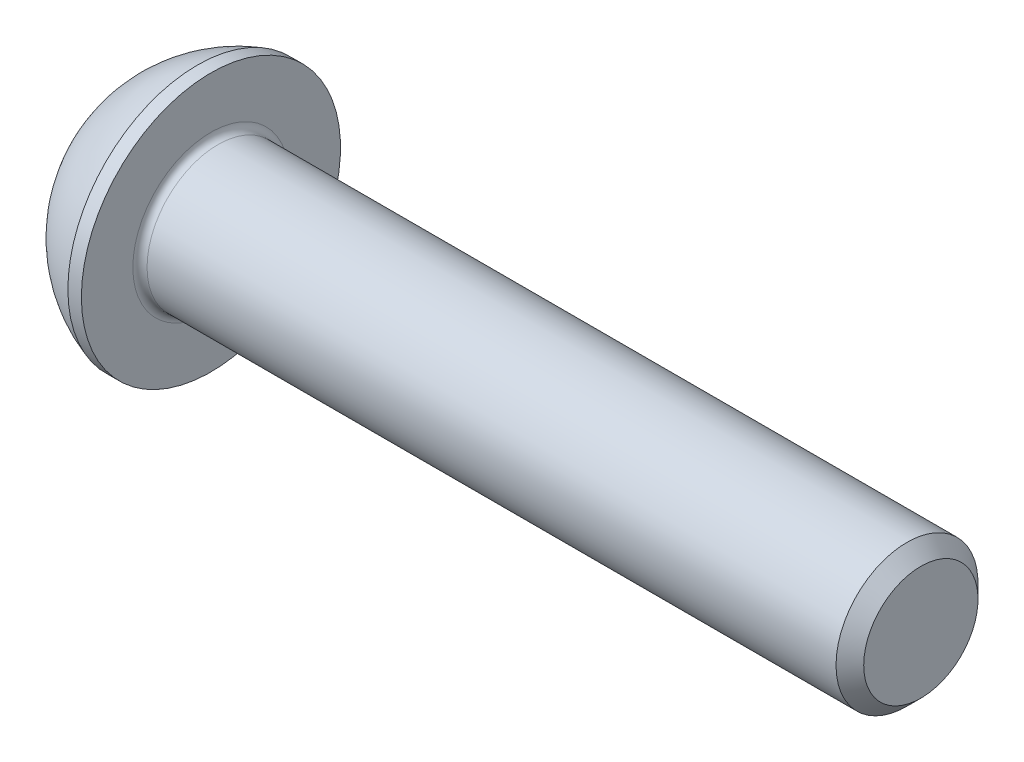
ISO-10303-21;
HEADER;
FILE_DESCRIPTION(('STEP AP214'),'2;1');
FILE_NAME('part.step','',(''),(''),'','','');
FILE_SCHEMA(('AUTOMOTIVE_DESIGN { 1 0 10303 214 1 1 1 1 }'));
ENDSEC;
DATA;
#1=APPLICATION_CONTEXT('core data for automotive mechanical design processes');
#2=APPLICATION_PROTOCOL_DEFINITION('international standard','automotive_design',2000,#1);
#3=PRODUCT_CONTEXT('',#1,'mechanical');
#4=PRODUCT('Part','Part','',(#3));
#5=PRODUCT_RELATED_PRODUCT_CATEGORY('part','',(#4));
#6=PRODUCT_DEFINITION_FORMATION('','',#4);
#7=PRODUCT_DEFINITION_CONTEXT('part definition',#1,'design');
#8=PRODUCT_DEFINITION('design','',#6,#7);
#9=PRODUCT_DEFINITION_SHAPE('','',#8);
#10=(LENGTH_UNIT() NAMED_UNIT(*) SI_UNIT(.MILLI.,.METRE.));
#11=(NAMED_UNIT(*) PLANE_ANGLE_UNIT() SI_UNIT($,.RADIAN.));
#12=(NAMED_UNIT(*) SI_UNIT($,.STERADIAN.) SOLID_ANGLE_UNIT());
#13=UNCERTAINTY_MEASURE_WITH_UNIT(LENGTH_MEASURE(1.E-05),#10,'distance_accuracy_value','');
#14=(GEOMETRIC_REPRESENTATION_CONTEXT(3) GLOBAL_UNCERTAINTY_ASSIGNED_CONTEXT((#13)) GLOBAL_UNIT_ASSIGNED_CONTEXT((#10,
#11,#12)) REPRESENTATION_CONTEXT('',''));
#15=CARTESIAN_POINT('',(0.,0.,0.));
#16=DIRECTION('',(0.,0.,1.));
#17=DIRECTION('',(1.,0.,0.));
#18=AXIS2_PLACEMENT_3D('',#15,#16,#17);
#19=CARTESIAN_POINT('',(0.,0.,0.));
#20=DIRECTION('',(-1.,0.,0.));
#21=DIRECTION('',(0.,0.,1.));
#22=AXIS2_PLACEMENT_3D('',#19,#20,#21);
#23=PLANE('',#22);
#24=CARTESIAN_POINT('',(0.,0.,0.));
#25=DIRECTION('',(-1.,0.,0.));
#26=DIRECTION('',(0.,0.,1.));
#27=AXIS2_PLACEMENT_3D('',#24,#25,#26);
#28=CIRCLE('',#27,1.825);
#29=CARTESIAN_POINT('',(0.,1.825,0.));
#30=VERTEX_POINT('',#29);
#31=EDGE_CURVE('E156',#30,#30,#28,.T.);
#32=ORIENTED_EDGE('',*,*,#31,.T.);
#33=EDGE_LOOP('',(#32));
#34=FACE_BOUND('',#33,.T.);
#35=DIRECTION('',(0.,-1.,0.));
#36=VECTOR('',#35,1.);
#37=CARTESIAN_POINT('',(0.,-0.721687836487031,1.25));
#38=LINE('',#37,#36);
#39=CARTESIAN_POINT('',(0.,0.721687836487033,1.25));
#40=VERTEX_POINT('',#39);
#41=CARTESIAN_POINT('',(0.,-0.721687836487031,1.25));
#42=VERTEX_POINT('',#41);
#43=EDGE_CURVE('E51',#40,#42,#38,.T.);
#44=ORIENTED_EDGE('',*,*,#43,.T.);
#45=DIRECTION('',(0.,-0.5,-0.866025403784438));
#46=VECTOR('',#45,1.);
#47=CARTESIAN_POINT('',(0.,-1.44337567297406,0.));
#48=LINE('',#47,#46);
#49=CARTESIAN_POINT('',(0.,-1.44337567297406,0.));
#50=VERTEX_POINT('',#49);
#51=EDGE_CURVE('E276',#42,#50,#48,.T.);
#52=ORIENTED_EDGE('',*,*,#51,.T.);
#53=DIRECTION('',(0.,0.5,-0.866025403784438));
#54=VECTOR('',#53,1.);
#55=CARTESIAN_POINT('',(0.,-0.721687836487032,-1.25));
#56=LINE('',#55,#54);
#57=CARTESIAN_POINT('',(0.,-0.721687836487032,-1.25));
#58=VERTEX_POINT('',#57);
#59=EDGE_CURVE('E131',#50,#58,#56,.T.);
#60=ORIENTED_EDGE('',*,*,#59,.T.);
#61=DIRECTION('',(0.,1.,0.));
#62=VECTOR('',#61,1.);
#63=CARTESIAN_POINT('',(0.,0.721687836487033,-1.25));
#64=LINE('',#63,#62);
#65=CARTESIAN_POINT('',(0.,0.721687836487033,-1.25));
#66=VERTEX_POINT('',#65);
#67=EDGE_CURVE('E279',#58,#66,#64,.T.);
#68=ORIENTED_EDGE('',*,*,#67,.T.);
#69=DIRECTION('',(0.,0.5,0.866025403784439));
#70=VECTOR('',#69,1.);
#71=CARTESIAN_POINT('',(0.,1.44337567297406,0.));
#72=LINE('',#71,#70);
#73=CARTESIAN_POINT('',(0.,1.44337567297406,0.));
#74=VERTEX_POINT('',#73);
#75=EDGE_CURVE('E281',#66,#74,#72,.T.);
#76=ORIENTED_EDGE('',*,*,#75,.T.);
#77=DIRECTION('',(0.,-0.5,0.866025403784439));
#78=VECTOR('',#77,1.);
#79=CARTESIAN_POINT('',(0.,0.721687836487033,1.25));
#80=LINE('',#79,#78);
#81=EDGE_CURVE('E283',#74,#40,#80,.T.);
#82=ORIENTED_EDGE('',*,*,#81,.T.);
#83=EDGE_LOOP('',(#44,#52,#60,#68,#76,#82));
#84=FACE_BOUND('',#83,.T.);
#85=ADVANCED_FACE('F36',(#34,#84),#23,.T.);
#86=CARTESIAN_POINT('',(3.3604222972973,0.,0.));
#87=DIRECTION('',(-1.,0.,0.));
#88=DIRECTION('',(0.,1.,0.));
#89=AXIS2_PLACEMENT_3D('',#86,#87,#88);
#90=SPHERICAL_SURFACE('',#89,3.82401137762074);
#91=CARTESIAN_POINT('',(2.22,0.,0.));
#92=DIRECTION('',(-1.,0.,0.));
#93=DIRECTION('',(0.,0.,1.));
#94=AXIS2_PLACEMENT_3D('',#91,#92,#93);
#95=CIRCLE('',#94,3.65);
#96=CARTESIAN_POINT('',(2.22,3.65,0.));
#97=VERTEX_POINT('',#96);
#98=EDGE_CURVE('E153',#97,#97,#95,.T.);
#99=CARTESIAN_POINT('',(2.22,3.65,0.));
#100=CARTESIAN_POINT('',(2.19070712092739,3.64084768261925,0.));
#101=CARTESIAN_POINT('',(2.16152446788423,3.63134259000291,0.));
#102=CARTESIAN_POINT('',(2.10339642085991,3.61163268371805,0.));
#103=CARTESIAN_POINT('',(2.07445102687874,3.60142787004953,0.));
#104=CARTESIAN_POINT('',(2.01681430498153,3.58032435107931,0.));
#105=CARTESIAN_POINT('',(1.98812297706548,3.56942564577762,0.));
#106=CARTESIAN_POINT('',(1.93101101018473,3.54694068384492,0.));
#107=CARTESIAN_POINT('',(1.90259037122003,3.53535442721391,0.));
#108=CARTESIAN_POINT('',(1.84603625809961,3.51150107233964,0.));
#109=CARTESIAN_POINT('',(1.8179027839439,3.49923397409637,0.));
#110=CARTESIAN_POINT('',(1.76193930720089,3.47402604816104,0.));
#111=CARTESIAN_POINT('',(1.73410930461359,3.46108522046899,0.));
#112=CARTESIAN_POINT('',(1.67876890257114,3.43453733623015,0.));
#113=CARTESIAN_POINT('',(1.65125850311598,3.42093027968337,0.));
#114=CARTESIAN_POINT('',(1.59657325345647,3.39305782506298,0.));
#115=CARTESIAN_POINT('',(1.56939840325212,3.37879242698938,0.));
#116=CARTESIAN_POINT('',(1.51540000376563,3.34961155809499,0.));
#117=CARTESIAN_POINT('',(1.48857645448349,3.33469608727419,0.));
#118=CARTESIAN_POINT('',(1.43529620487076,3.30422371851414,0.));
#119=CARTESIAN_POINT('',(1.40883950454015,3.28866682057488,0.));
#120=CARTESIAN_POINT('',(1.35630828822271,3.25692061499341,0.));
#121=CARTESIAN_POINT('',(1.33023377223587,3.2407313073512,0.));
#122=CARTESIAN_POINT('',(1.27848203846745,3.20772966635286,0.));
#123=CARTESIAN_POINT('',(1.25280482068587,3.19091733299673,0.));
#124=CARTESIAN_POINT('',(1.20186256689933,3.15667938569018,0.));
#125=CARTESIAN_POINT('',(1.17659753089438,3.13925377173975,0.));
#126=CARTESIAN_POINT('',(1.12649428531491,3.10379936384706,0.));
#127=CARTESIAN_POINT('',(1.10165607574039,3.08577056990479,0.));
#128=CARTESIAN_POINT('',(1.05242088026944,3.04912025225874,0.));
#129=CARTESIAN_POINT('',(1.02802389437301,3.03049872855496,0.));
#130=CARTESIAN_POINT('',(0.979685287754531,2.9926737451868,0.));
#131=CARTESIAN_POINT('',(0.955743667032474,2.97347028552241,0.));
#132=CARTESIAN_POINT('',(0.908329668310624,2.93449256134791,0.));
#133=CARTESIAN_POINT('',(0.88485729031083,2.91471829683781,0.));
#134=CARTESIAN_POINT('',(0.838395382589022,2.87461042494875,0.));
#135=CARTESIAN_POINT('',(0.815405852867006,2.8542768175698,0.));
#136=CARTESIAN_POINT('',(0.769922967377556,2.81306204613804,0.));
#137=CARTESIAN_POINT('',(0.747429611610121,2.79218088208524,0.));
#138=CARTESIAN_POINT('',(0.70295211210379,2.74988310088713,0.));
#139=CARTESIAN_POINT('',(0.680967968364895,2.72846648374183,0.));
#140=CARTESIAN_POINT('',(0.637521635829424,2.68511021031069,0.));
#141=CARTESIAN_POINT('',(0.616059447032848,2.66317055402486,0.));
#142=CARTESIAN_POINT('',(0.573669464749056,2.61878091943974,0.));
#143=CARTESIAN_POINT('',(0.552741671261841,2.59633094114045,0.));
#144=CARTESIAN_POINT('',(0.511432610207024,2.55093367545869,0.));
#145=CARTESIAN_POINT('',(0.491051342639423,2.52798638807622,0.));
#146=CARTESIAN_POINT('',(0.450847147242546,2.48160780542071,0.));
#147=CARTESIAN_POINT('',(0.431024219413271,2.45817651014767,0.));
#148=CARTESIAN_POINT('',(0.391948193684953,2.41084349344881,0.));
#149=CARTESIAN_POINT('',(0.37269509578591,2.386941772023,0.));
#150=CARTESIAN_POINT('',(0.334769889776281,2.33868175745591,0.));
#151=CARTESIAN_POINT('',(0.316097781665695,2.31432346431464,0.));
#152=CARTESIAN_POINT('',(0.279345378463054,2.26516442532271,0.));
#153=CARTESIAN_POINT('',(0.261265083370999,2.24036367947205,0.));
#154=CARTESIAN_POINT('',(0.225706785883461,2.19033411082596,0.));
#155=CARTESIAN_POINT('',(0.208228783487977,2.16510528803053,0.));
#156=CARTESIAN_POINT('',(0.173885203872077,2.11423418829049,0.));
#157=CARTESIAN_POINT('',(0.157019626651659,2.08859191134589,0.));
#158=CARTESIAN_POINT('',(0.123910667734166,2.03690876986336,0.));
#159=CARTESIAN_POINT('',(0.10766728603709,2.01086790532544,0.));
#160=CARTESIAN_POINT('',(0.0758121545239918,1.95840267092907,0.));
#161=CARTESIAN_POINT('',(0.0602004047079698,1.93197830107062,0.));
#162=CARTESIAN_POINT('',(0.029617507700087,1.87876141777946,0.));
#163=CARTESIAN_POINT('',(0.0146463605082264,1.85196890434674,0.));
#164=CARTESIAN_POINT('',(0.,1.825,0.));
#165=B_SPLINE_CURVE_WITH_KNOTS('',3,(#99,#100,#101,#102,#103,#104,#105,#106,#107,#108,#109,#110,
#111,#112,#113,#114,#115,#116,#117,#118,#119,#120,#121,#122,#123,#124,#125,#126,#127,#128,#129,
#130,#131,#132,#133,#134,#135,#136,#137,#138,#139,#140,#141,#142,#143,#144,#145,#146,#147,#148,
#149,#150,#151,#152,#153,#154,#155,#156,#157,#158,#159,#160,#161,#162,#163,#164),.UNSPECIFIED.,
.F.,.F.,(4,2,2,2,2,2,2,2,2,2,2,2,2,2,2,2,2,2,2,2,2,2,2,2,2,2,2,2,2,2,2,2,4),(0.,
0.0920658929861413,0.184131785972283,0.276197678958424,0.368263571944565,0.460329464930706,
0.552395357916847,0.644461250902988,0.736527143889129,0.828593036875271,0.920658929861412,
1.01272482284755,1.10479071583369,1.19685660881984,1.28892250180598,1.38098839479212,
1.47305428777826,1.5651201807644,1.65718607375054,1.74925196673668,1.84131785972282,
1.93338375270897,2.02544964569511,2.11751553868125,2.20958143166739,2.30164732465353,
2.39371321763967,2.48577911062581,2.57784500361196,2.6699108965981,2.76197678958424,
2.85404268257038,2.94610857555652),.UNSPECIFIED.);
#166=EDGE_CURVE('BSEAM177',#97,#30,#165,.T.);
#167=ORIENTED_EDGE('',*,*,#98,.T.);
#168=ORIENTED_EDGE('',*,*,#31,.F.);
#169=ORIENTED_EDGE('',*,*,#166,.T.);
#170=ORIENTED_EDGE('',*,*,#166,.F.);
#171=EDGE_LOOP('',(#167,#169,#168,#170));
#172=FACE_BOUND('',#171,.T.);
#173=ADVANCED_FACE('F177',(#172),#90,.T.);
#174=CARTESIAN_POINT('',(0.,0.,0.));
#175=DIRECTION('',(-1.,0.,0.));
#176=DIRECTION('',(0.,0.,1.));
#177=AXIS2_PLACEMENT_3D('',#174,#175,#176);
#178=CYLINDRICAL_SURFACE('',#177,3.65);
#179=ORIENTED_EDGE('',*,*,#98,.F.);
#180=EDGE_LOOP('',(#179));
#181=FACE_BOUND('',#180,.T.);
#182=CARTESIAN_POINT('',(2.6,0.,0.));
#183=DIRECTION('',(-1.,0.,0.));
#184=DIRECTION('',(0.,0.,1.));
#185=AXIS2_PLACEMENT_3D('',#182,#183,#184);
#186=CIRCLE('',#185,3.65);
#187=CARTESIAN_POINT('',(2.6,0.,3.65));
#188=VERTEX_POINT('',#187);
#189=EDGE_CURVE('E150',#188,#188,#186,.T.);
#190=ORIENTED_EDGE('',*,*,#189,.T.);
#191=EDGE_LOOP('',(#190));
#192=FACE_BOUND('',#191,.T.);
#193=ADVANCED_FACE('F182',(#181,#192),#178,.T.);
#194=CARTESIAN_POINT('',(2.6,2.,0.));
#195=DIRECTION('',(-1.,0.,0.));
#196=DIRECTION('',(0.,0.,1.));
#197=AXIS2_PLACEMENT_3D('',#194,#195,#196);
#198=PLANE('',#197);
#199=CARTESIAN_POINT('',(2.6,0.,0.));
#200=DIRECTION('',(-1.,0.,0.));
#201=DIRECTION('',(0.,0.,1.));
#202=AXIS2_PLACEMENT_3D('',#199,#200,#201);
#203=CIRCLE('',#202,2.2);
#204=CARTESIAN_POINT('',(2.6,0.,2.2));
#205=VERTEX_POINT('',#204);
#206=EDGE_CURVE('E44',#205,#205,#203,.T.);
#207=ORIENTED_EDGE('',*,*,#206,.T.);
#208=EDGE_LOOP('',(#207));
#209=FACE_BOUND('',#208,.T.);
#210=ORIENTED_EDGE('',*,*,#189,.F.);
#211=EDGE_LOOP('',(#210));
#212=FACE_BOUND('',#211,.T.);
#213=ADVANCED_FACE('F161',(#209,#212),#198,.F.);
#214=CARTESIAN_POINT('',(0.,0.,0.));
#215=DIRECTION('',(-1.,0.,0.));
#216=DIRECTION('',(0.,0.,1.));
#217=AXIS2_PLACEMENT_3D('',#214,#215,#216);
#218=CYLINDRICAL_SURFACE('',#217,2.);
#219=CARTESIAN_POINT('',(2.8,0.,0.));
#220=DIRECTION('',(-1.,0.,0.));
#221=DIRECTION('',(0.,0.,1.));
#222=AXIS2_PLACEMENT_3D('',#219,#220,#221);
#223=CIRCLE('',#222,2.);
#224=CARTESIAN_POINT('',(2.8,0.,2.));
#225=VERTEX_POINT('',#224);
#226=EDGE_CURVE('E11',#225,#225,#223,.F.);
#227=ORIENTED_EDGE('',*,*,#226,.T.);
#228=EDGE_LOOP('',(#227));
#229=FACE_BOUND('',#228,.T.);
#230=CARTESIAN_POINT('',(22.21,0.,0.));
#231=DIRECTION('',(-1.,0.,0.));
#232=DIRECTION('',(0.,0.,1.));
#233=AXIS2_PLACEMENT_3D('',#230,#231,#232);
#234=CIRCLE('',#233,2.);
#235=CARTESIAN_POINT('',(22.21,0.,2.));
#236=VERTEX_POINT('',#235);
#237=EDGE_CURVE('E147',#236,#236,#234,.T.);
#238=ORIENTED_EDGE('',*,*,#237,.T.);
#239=EDGE_LOOP('',(#238));
#240=FACE_BOUND('',#239,.T.);
#241=ADVANCED_FACE('F191',(#229,#240),#218,.T.);
#242=CARTESIAN_POINT('',(22.6,0.,0.));
#243=DIRECTION('',(-1.,0.,0.));
#244=DIRECTION('',(0.,0.,1.));
#245=AXIS2_PLACEMENT_3D('',#242,#243,#244);
#246=CONICAL_SURFACE('',#245,1.61,0.785398163397442);
#247=ORIENTED_EDGE('',*,*,#237,.F.);
#248=EDGE_LOOP('',(#247));
#249=FACE_BOUND('',#248,.T.);
#250=CARTESIAN_POINT('',(22.6,0.,0.));
#251=DIRECTION('',(-1.,0.,0.));
#252=DIRECTION('',(0.,0.,1.));
#253=AXIS2_PLACEMENT_3D('',#250,#251,#252);
#254=CIRCLE('',#253,1.61);
#255=CARTESIAN_POINT('',(22.6,0.,1.61));
#256=VERTEX_POINT('',#255);
#257=EDGE_CURVE('E143',#256,#256,#254,.T.);
#258=ORIENTED_EDGE('',*,*,#257,.T.);
#259=EDGE_LOOP('',(#258));
#260=FACE_BOUND('',#259,.T.);
#261=ADVANCED_FACE('F172',(#249,#260),#246,.T.);
#262=CARTESIAN_POINT('',(22.6,0.,0.));
#263=DIRECTION('',(-1.,0.,0.));
#264=DIRECTION('',(0.,0.,1.));
#265=AXIS2_PLACEMENT_3D('',#262,#263,#264);
#266=PLANE('',#265);
#267=ORIENTED_EDGE('',*,*,#257,.F.);
#268=EDGE_LOOP('',(#267));
#269=FACE_BOUND('',#268,.T.);
#270=ADVANCED_FACE('F165',(#269),#266,.F.);
#271=CARTESIAN_POINT('',(2.8,0.,0.));
#272=DIRECTION('',(-1.,0.,0.));
#273=DIRECTION('',(0.,0.,1.));
#274=AXIS2_PLACEMENT_3D('',#271,#272,#273);
#275=TOROIDAL_SURFACE('',#274,2.2,0.2);
#276=ORIENTED_EDGE('',*,*,#226,.F.);
#277=EDGE_LOOP('',(#276));
#278=FACE_BOUND('',#277,.T.);
#279=ORIENTED_EDGE('',*,*,#206,.F.);
#280=EDGE_LOOP('',(#279));
#281=FACE_BOUND('',#280,.T.);
#282=ADVANCED_FACE('F38',(#278,#281),#275,.F.);
#283=CARTESIAN_POINT('',(1.3,-1.44337567297406,0.));
#284=DIRECTION('',(0.,0.866025403784438,-0.5));
#285=DIRECTION('',(0.,0.5,0.866025403784438));
#286=AXIS2_PLACEMENT_3D('',#283,#284,#285);
#287=PLANE('',#286);
#288=DIRECTION('',(0.,-0.5,-0.866025403784438));
#289=VECTOR('',#288,1.);
#290=CARTESIAN_POINT('',(1.3,-1.44337567297406,0.));
#291=LINE('',#290,#289);
#292=CARTESIAN_POINT('',(1.3,-0.721687836487031,1.25));
#293=VERTEX_POINT('',#292);
#294=CARTESIAN_POINT('',(1.3,-1.08253175473055,0.625));
#295=VERTEX_POINT('',#294);
#296=EDGE_CURVE('E117',#293,#295,#291,.T.);
#297=ORIENTED_EDGE('',*,*,#296,.T.);
#298=CARTESIAN_POINT('',(1.3,-1.44337567297406,0.));
#299=VERTEX_POINT('',#298);
#300=EDGE_CURVE('E112',#295,#299,#291,.T.);
#301=ORIENTED_EDGE('',*,*,#300,.T.);
#302=DIRECTION('',(-1.,0.,0.));
#303=VECTOR('',#302,1.);
#304=CARTESIAN_POINT('',(1.3,-1.44337567297406,0.));
#305=LINE('',#304,#303);
#306=EDGE_CURVE('E114',#299,#50,#305,.T.);
#307=ORIENTED_EDGE('',*,*,#306,.T.);
#308=ORIENTED_EDGE('',*,*,#51,.F.);
#309=DIRECTION('',(-1.,0.,0.));
#310=VECTOR('',#309,1.);
#311=CARTESIAN_POINT('',(1.3,-0.721687836487031,1.25));
#312=LINE('',#311,#310);
#313=EDGE_CURVE('E272',#293,#42,#312,.T.);
#314=ORIENTED_EDGE('',*,*,#313,.F.);
#315=EDGE_LOOP('',(#297,#301,#307,#308,#314));
#316=FACE_BOUND('',#315,.T.);
#317=ADVANCED_FACE('F113',(#316),#287,.T.);
#318=CARTESIAN_POINT('',(1.3,-0.721687836487032,-1.25));
#319=DIRECTION('',(0.,0.866025403784438,0.5));
#320=DIRECTION('',(0.,-0.5,0.866025403784439));
#321=AXIS2_PLACEMENT_3D('',#318,#319,#320);
#322=PLANE('',#321);
#323=DIRECTION('',(0.,0.5,-0.866025403784438));
#324=VECTOR('',#323,1.);
#325=CARTESIAN_POINT('',(1.3,-0.721687836487032,-1.25));
#326=LINE('',#325,#324);
#327=CARTESIAN_POINT('',(1.3,-1.08253175473055,-0.625000000000001));
#328=VERTEX_POINT('',#327);
#329=EDGE_CURVE('E59',#299,#328,#326,.T.);
#330=ORIENTED_EDGE('',*,*,#329,.T.);
#331=CARTESIAN_POINT('',(1.3,-0.721687836487032,-1.25));
#332=VERTEX_POINT('',#331);
#333=EDGE_CURVE('E126',#328,#332,#326,.T.);
#334=ORIENTED_EDGE('',*,*,#333,.T.);
#335=DIRECTION('',(-1.,0.,0.));
#336=VECTOR('',#335,1.);
#337=CARTESIAN_POINT('',(1.3,-0.721687836487032,-1.25));
#338=LINE('',#337,#336);
#339=EDGE_CURVE('E133',#332,#58,#338,.T.);
#340=ORIENTED_EDGE('',*,*,#339,.T.);
#341=ORIENTED_EDGE('',*,*,#59,.F.);
#342=ORIENTED_EDGE('',*,*,#306,.F.);
#343=EDGE_LOOP('',(#330,#334,#340,#341,#342));
#344=FACE_BOUND('',#343,.T.);
#345=ADVANCED_FACE('F129',(#344),#322,.T.);
#346=CARTESIAN_POINT('',(1.3,0.721687836487033,-1.25));
#347=DIRECTION('',(0.,0.,1.));
#348=DIRECTION('',(1.,0.,0.));
#349=AXIS2_PLACEMENT_3D('',#346,#347,#348);
#350=PLANE('',#349);
#351=DIRECTION('',(0.,1.,0.));
#352=VECTOR('',#351,1.);
#353=CARTESIAN_POINT('',(1.3,0.721687836487033,-1.25));
#354=LINE('',#353,#352);
#355=CARTESIAN_POINT('',(1.3,0.,-1.25));
#356=VERTEX_POINT('',#355);
#357=EDGE_CURVE('E253',#332,#356,#354,.T.);
#358=ORIENTED_EDGE('',*,*,#357,.T.);
#359=CARTESIAN_POINT('',(1.3,0.721687836487033,-1.25));
#360=VERTEX_POINT('',#359);
#361=EDGE_CURVE('E125',#356,#360,#354,.T.);
#362=ORIENTED_EDGE('',*,*,#361,.T.);
#363=DIRECTION('',(-1.,0.,0.));
#364=VECTOR('',#363,1.);
#365=CARTESIAN_POINT('',(1.3,0.721687836487033,-1.25));
#366=LINE('',#365,#364);
#367=EDGE_CURVE('E138',#360,#66,#366,.T.);
#368=ORIENTED_EDGE('',*,*,#367,.T.);
#369=ORIENTED_EDGE('',*,*,#67,.F.);
#370=ORIENTED_EDGE('',*,*,#339,.F.);
#371=EDGE_LOOP('',(#358,#362,#368,#369,#370));
#372=FACE_BOUND('',#371,.T.);
#373=ADVANCED_FACE('F205',(#372),#350,.T.);
#374=CARTESIAN_POINT('',(1.3,1.44337567297406,0.));
#375=DIRECTION('',(0.,-0.866025403784439,0.5));
#376=DIRECTION('',(0.,-0.5,-0.866025403784439));
#377=AXIS2_PLACEMENT_3D('',#374,#375,#376);
#378=PLANE('',#377);
#379=DIRECTION('',(0.,0.5,0.866025403784439));
#380=VECTOR('',#379,1.);
#381=CARTESIAN_POINT('',(1.3,1.44337567297406,0.));
#382=LINE('',#381,#380);
#383=CARTESIAN_POINT('',(1.3,1.08253175473055,-0.625));
#384=VERTEX_POINT('',#383);
#385=EDGE_CURVE('E242',#360,#384,#382,.T.);
#386=ORIENTED_EDGE('',*,*,#385,.T.);
#387=CARTESIAN_POINT('',(1.3,1.44337567297406,0.));
#388=VERTEX_POINT('',#387);
#389=EDGE_CURVE('E247',#384,#388,#382,.T.);
#390=ORIENTED_EDGE('',*,*,#389,.T.);
#391=DIRECTION('',(-1.,0.,0.));
#392=VECTOR('',#391,1.);
#393=CARTESIAN_POINT('',(1.3,1.44337567297406,0.));
#394=LINE('',#393,#392);
#395=EDGE_CURVE('E287',#388,#74,#394,.T.);
#396=ORIENTED_EDGE('',*,*,#395,.T.);
#397=ORIENTED_EDGE('',*,*,#75,.F.);
#398=ORIENTED_EDGE('',*,*,#367,.F.);
#399=EDGE_LOOP('',(#386,#390,#396,#397,#398));
#400=FACE_BOUND('',#399,.T.);
#401=ADVANCED_FACE('F208',(#400),#378,.T.);
#402=CARTESIAN_POINT('',(1.3,0.721687836487033,1.25));
#403=DIRECTION('',(0.,-0.866025403784439,-0.5));
#404=DIRECTION('',(0.,0.5,-0.866025403784439));
#405=AXIS2_PLACEMENT_3D('',#402,#403,#404);
#406=PLANE('',#405);
#407=DIRECTION('',(0.,-0.5,0.866025403784439));
#408=VECTOR('',#407,1.);
#409=CARTESIAN_POINT('',(1.3,0.721687836487033,1.25));
#410=LINE('',#409,#408);
#411=CARTESIAN_POINT('',(1.3,1.08253175473055,0.625));
#412=VERTEX_POINT('',#411);
#413=EDGE_CURVE('E250',#388,#412,#410,.T.);
#414=ORIENTED_EDGE('',*,*,#413,.T.);
#415=CARTESIAN_POINT('',(1.3,0.721687836487033,1.25));
#416=VERTEX_POINT('',#415);
#417=EDGE_CURVE('E258',#412,#416,#410,.T.);
#418=ORIENTED_EDGE('',*,*,#417,.T.);
#419=DIRECTION('',(-1.,0.,0.));
#420=VECTOR('',#419,1.);
#421=CARTESIAN_POINT('',(1.3,0.721687836487033,1.25));
#422=LINE('',#421,#420);
#423=EDGE_CURVE('E271',#416,#40,#422,.T.);
#424=ORIENTED_EDGE('',*,*,#423,.T.);
#425=ORIENTED_EDGE('',*,*,#81,.F.);
#426=ORIENTED_EDGE('',*,*,#395,.F.);
#427=EDGE_LOOP('',(#414,#418,#424,#425,#426));
#428=FACE_BOUND('',#427,.T.);
#429=ADVANCED_FACE('F212',(#428),#406,.T.);
#430=CARTESIAN_POINT('',(1.3,-0.721687836487031,1.25));
#431=DIRECTION('',(0.,0.,-1.));
#432=DIRECTION('',(0.,1.,0.));
#433=AXIS2_PLACEMENT_3D('',#430,#431,#432);
#434=PLANE('',#433);
#435=DIRECTION('',(0.,-1.,0.));
#436=VECTOR('',#435,1.);
#437=CARTESIAN_POINT('',(1.3,-0.721687836487031,1.25));
#438=LINE('',#437,#436);
#439=CARTESIAN_POINT('',(1.3,0.,1.25));
#440=VERTEX_POINT('',#439);
#441=EDGE_CURVE('E264',#416,#440,#438,.T.);
#442=ORIENTED_EDGE('',*,*,#441,.T.);
#443=EDGE_CURVE('E266',#440,#293,#438,.T.);
#444=ORIENTED_EDGE('',*,*,#443,.T.);
#445=ORIENTED_EDGE('',*,*,#313,.T.);
#446=ORIENTED_EDGE('',*,*,#43,.F.);
#447=ORIENTED_EDGE('',*,*,#423,.F.);
#448=EDGE_LOOP('',(#442,#444,#445,#446,#447));
#449=FACE_BOUND('',#448,.T.);
#450=ADVANCED_FACE('F216',(#449),#434,.T.);
#451=CARTESIAN_POINT('',(1.3,-1.44337567297406,0.));
#452=DIRECTION('',(1.,0.,0.));
#453=DIRECTION('',(0.,0.,-1.));
#454=AXIS2_PLACEMENT_3D('',#451,#452,#453);
#455=PLANE('',#454);
#456=CARTESIAN_POINT('',(1.3,0.,0.));
#457=DIRECTION('',(-1.,0.,0.));
#458=DIRECTION('',(0.,0.,1.));
#459=AXIS2_PLACEMENT_3D('',#456,#457,#458);
#460=CIRCLE('',#459,1.25);
#461=EDGE_CURVE('E239',#384,#356,#460,.T.);
#462=ORIENTED_EDGE('',*,*,#461,.F.);
#463=ORIENTED_EDGE('',*,*,#385,.F.);
#464=ORIENTED_EDGE('',*,*,#361,.F.);
#465=EDGE_LOOP('',(#462,#463,#464));
#466=FACE_BOUND('',#465,.T.);
#467=ADVANCED_FACE('F220',(#466),#455,.F.);
#468=EDGE_CURVE('E144',#412,#384,#460,.T.);
#469=ORIENTED_EDGE('',*,*,#468,.F.);
#470=ORIENTED_EDGE('',*,*,#413,.F.);
#471=ORIENTED_EDGE('',*,*,#389,.F.);
#472=EDGE_LOOP('',(#469,#470,#471));
#473=FACE_BOUND('',#472,.T.);
#474=ADVANCED_FACE('F229',(#473),#455,.F.);
#475=EDGE_CURVE('E137',#440,#412,#460,.T.);
#476=ORIENTED_EDGE('',*,*,#475,.F.);
#477=ORIENTED_EDGE('',*,*,#441,.F.);
#478=ORIENTED_EDGE('',*,*,#417,.F.);
#479=EDGE_LOOP('',(#476,#477,#478));
#480=FACE_BOUND('',#479,.T.);
#481=ADVANCED_FACE('F234',(#480),#455,.F.);
#482=EDGE_CURVE('E132',#295,#440,#460,.T.);
#483=ORIENTED_EDGE('',*,*,#482,.F.);
#484=ORIENTED_EDGE('',*,*,#296,.F.);
#485=ORIENTED_EDGE('',*,*,#443,.F.);
#486=EDGE_LOOP('',(#483,#484,#485));
#487=FACE_BOUND('',#486,.T.);
#488=ADVANCED_FACE('F227',(#487),#455,.F.);
#489=EDGE_CURVE('E123',#328,#295,#460,.T.);
#490=ORIENTED_EDGE('',*,*,#489,.F.);
#491=ORIENTED_EDGE('',*,*,#329,.F.);
#492=ORIENTED_EDGE('',*,*,#300,.F.);
#493=EDGE_LOOP('',(#490,#491,#492));
#494=FACE_BOUND('',#493,.T.);
#495=ADVANCED_FACE('F122',(#494),#455,.F.);
#496=EDGE_CURVE('E245',#356,#328,#460,.T.);
#497=ORIENTED_EDGE('',*,*,#496,.F.);
#498=ORIENTED_EDGE('',*,*,#357,.F.);
#499=ORIENTED_EDGE('',*,*,#333,.F.);
#500=EDGE_LOOP('',(#497,#498,#499));
#501=FACE_BOUND('',#500,.T.);
#502=ADVANCED_FACE('F200',(#501),#455,.F.);
#503=CARTESIAN_POINT('',(2.02168783648704,0.,0.));
#504=DIRECTION('',(-1.,0.,0.));
#505=DIRECTION('',(0.,0.,1.));
#506=AXIS2_PLACEMENT_3D('',#503,#504,#505);
#507=CONICAL_SURFACE('',#506,0.,1.04719755119659);
#508=ORIENTED_EDGE('',*,*,#475,.T.);
#509=ORIENTED_EDGE('',*,*,#468,.T.);
#510=ORIENTED_EDGE('',*,*,#461,.T.);
#511=ORIENTED_EDGE('',*,*,#496,.T.);
#512=ORIENTED_EDGE('',*,*,#489,.T.);
#513=ORIENTED_EDGE('',*,*,#482,.T.);
#514=EDGE_LOOP('',(#508,#509,#510,#511,#512,#513));
#515=FACE_BOUND('',#514,.T.);
#516=CARTESIAN_POINT('',(2.02168783648704,0.,0.));
#517=VERTEX_POINT('',#516);
#518=VERTEX_LOOP('',#517);
#519=FACE_BOUND('',#518,.T.);
#520=ADVANCED_FACE('F198',(#515,#519),#507,.F.);
#521=CLOSED_SHELL('',(#85,#173,#193,#213,#241,#261,#270,#282,#317,#345,#373,#401,#429,#450,#467,
#474,#481,#488,#495,#502,#520));
#522=MANIFOLD_SOLID_BREP('B2',#521);
#523=ADVANCED_BREP_SHAPE_REPRESENTATION('',(#18,#522),#14);
#524=SHAPE_DEFINITION_REPRESENTATION(#9,#523);
ENDSEC;
END-ISO-10303-21;
